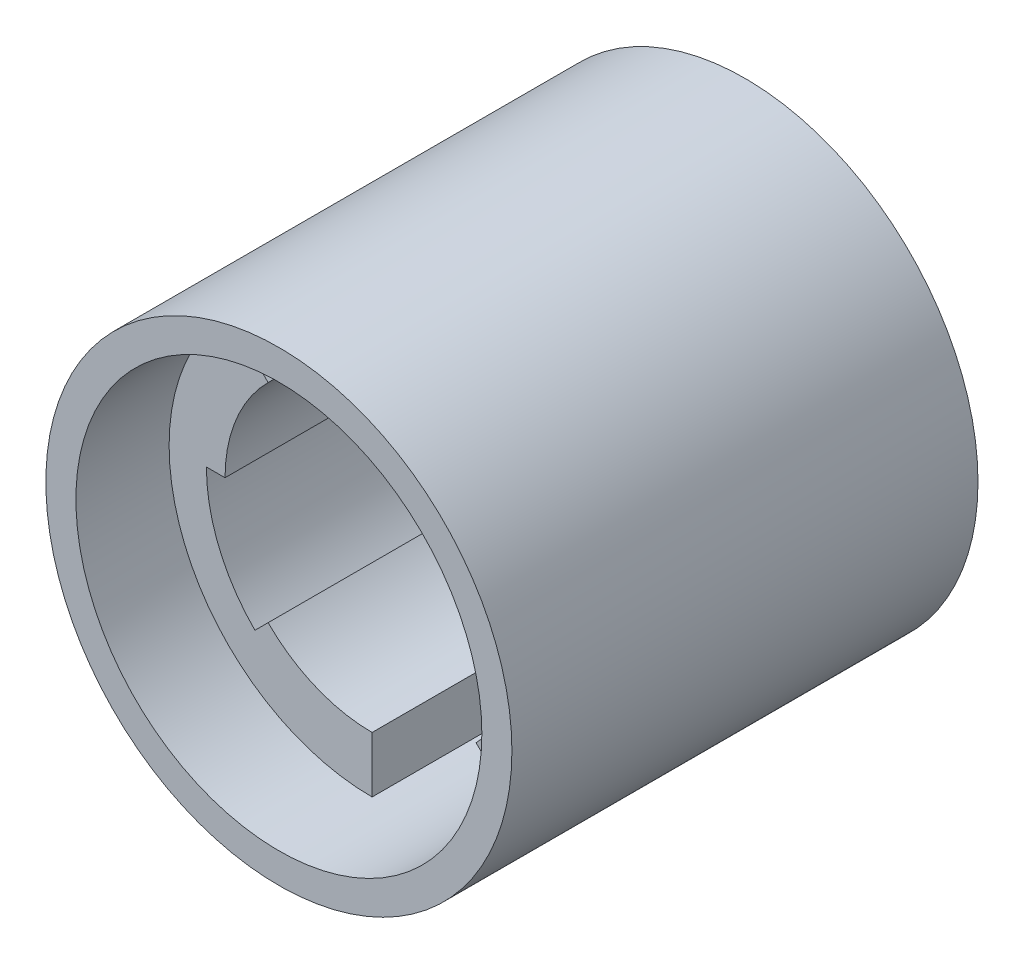
ISO-10303-21;
HEADER;
FILE_DESCRIPTION(('STEP AP214'),'2;1');
FILE_NAME('part.step','',(''),(''),'','','');
FILE_SCHEMA(('AUTOMOTIVE_DESIGN { 1 0 10303 214 1 1 1 1 }'));
ENDSEC;
DATA;
#1=APPLICATION_CONTEXT('core data for automotive mechanical design processes');
#2=APPLICATION_PROTOCOL_DEFINITION('international standard','automotive_design',2000,#1);
#3=PRODUCT_CONTEXT('',#1,'mechanical');
#4=PRODUCT('Part','Part','',(#3));
#5=PRODUCT_RELATED_PRODUCT_CATEGORY('part','',(#4));
#6=PRODUCT_DEFINITION_FORMATION('','',#4);
#7=PRODUCT_DEFINITION_CONTEXT('part definition',#1,'design');
#8=PRODUCT_DEFINITION('design','',#6,#7);
#9=PRODUCT_DEFINITION_SHAPE('','',#8);
#10=(LENGTH_UNIT() NAMED_UNIT(*) SI_UNIT(.MILLI.,.METRE.));
#11=(NAMED_UNIT(*) PLANE_ANGLE_UNIT() SI_UNIT($,.RADIAN.));
#12=(NAMED_UNIT(*) SI_UNIT($,.STERADIAN.) SOLID_ANGLE_UNIT());
#13=UNCERTAINTY_MEASURE_WITH_UNIT(LENGTH_MEASURE(1.E-05),#10,'distance_accuracy_value','');
#14=(GEOMETRIC_REPRESENTATION_CONTEXT(3) GLOBAL_UNCERTAINTY_ASSIGNED_CONTEXT((#13)) GLOBAL_UNIT_ASSIGNED_CONTEXT((#10,
#11,#12)) REPRESENTATION_CONTEXT('',''));
#15=CARTESIAN_POINT('',(0.,0.,0.));
#16=DIRECTION('',(0.,0.,1.));
#17=DIRECTION('',(1.,0.,0.));
#18=AXIS2_PLACEMENT_3D('',#15,#16,#17);
#19=CARTESIAN_POINT('',(0.,0.,40.));
#20=DIRECTION('',(0.,0.,-1.));
#21=DIRECTION('',(-1.,0.,0.));
#22=AXIS2_PLACEMENT_3D('',#19,#20,#21);
#23=PLANE('',#22);
#24=DIRECTION('',(0.,-1.,0.));
#25=VECTOR('',#24,1.);
#26=CARTESIAN_POINT('',(0.,0.,40.));
#27=LINE('',#26,#25);
#28=CARTESIAN_POINT('',(0.,21.775,40.));
#29=VERTEX_POINT('',#28);
#30=CARTESIAN_POINT('',(-2.8421709430404E-11,19.0256907860089,40.));
#31=VERTEX_POINT('',#30);
#32=EDGE_CURVE('E368',#29,#31,#27,.T.);
#33=ORIENTED_EDGE('',*,*,#32,.T.);
#34=DIRECTION('',(-0.382683432365091,-0.923879532511286,0.));
#35=VECTOR('',#34,1.);
#36=CARTESIAN_POINT('',(207098.900487391,500000.,40.));
#37=LINE('',#36,#35);
#38=CARTESIAN_POINT('',(1.12671862772536,21.745830178081,40.));
#39=VERTEX_POINT('',#38);
#40=EDGE_CURVE('E313',#39,#31,#37,.T.);
#41=ORIENTED_EDGE('',*,*,#40,.F.);
#42=CARTESIAN_POINT('',(0.,0.,40.));
#43=DIRECTION('',(0.,0.,-1.));
#44=DIRECTION('',(-1.,0.,0.));
#45=AXIS2_PLACEMENT_3D('',#42,#43,#44);
#46=CIRCLE('',#45,21.775);
#47=EDGE_CURVE('E371',#39,#29,#46,.F.);
#48=ORIENTED_EDGE('',*,*,#47,.T.);
#49=EDGE_LOOP('',(#33,#41,#48));
#50=FACE_BOUND('',#49,.T.);
#51=ADVANCED_FACE('F85',(#50),#23,.F.);
#52=CARTESIAN_POINT('',(15.397250160337,-15.3972501603371,40.));
#53=VERTEX_POINT('',#52);
#54=CARTESIAN_POINT('',(14.3012088322824,16.4202938748199,40.));
#55=VERTEX_POINT('',#54);
#56=EDGE_CURVE('E372',#53,#55,#46,.F.);
#57=ORIENTED_EDGE('',*,*,#56,.T.);
#58=DIRECTION('',(0.382683432365091,0.923879532511286,0.));
#59=VECTOR('',#58,1.);
#60=CARTESIAN_POINT('',(207112.028479592,499994.562207584,40.));
#61=LINE('',#60,#59);
#62=CARTESIAN_POINT('',(12.6655155217409,12.4713809006276,40.));
#63=VERTEX_POINT('',#62);
#64=EDGE_CURVE('E316',#63,#55,#61,.T.);
#65=ORIENTED_EDGE('',*,*,#64,.F.);
#66=CARTESIAN_POINT('',(0.,0.,40.));
#67=DIRECTION('',(0.,0.,-1.));
#68=DIRECTION('',(-1.,0.,0.));
#69=AXIS2_PLACEMENT_3D('',#66,#67,#68);
#70=CIRCLE('',#69,17.775);
#71=CARTESIAN_POINT('',(17.775,0.,40.));
#72=VERTEX_POINT('',#71);
#73=EDGE_CURVE('E382',#63,#72,#70,.T.);
#74=ORIENTED_EDGE('',*,*,#73,.T.);
#75=DIRECTION('',(-1.,0.,0.));
#76=VECTOR('',#75,1.);
#77=CARTESIAN_POINT('',(0.,0.,40.));
#78=LINE('',#77,#76);
#79=CARTESIAN_POINT('',(15.775,0.,40.));
#80=VERTEX_POINT('',#79);
#81=EDGE_CURVE('E380',#72,#80,#78,.T.);
#82=ORIENTED_EDGE('',*,*,#81,.T.);
#83=CARTESIAN_POINT('',(0.,0.,40.));
#84=DIRECTION('',(0.,0.,-1.));
#85=DIRECTION('',(-1.,0.,0.));
#86=AXIS2_PLACEMENT_3D('',#83,#84,#85);
#87=CIRCLE('',#86,15.775);
#88=CARTESIAN_POINT('',(11.1546094732177,-11.1546094732178,40.));
#89=VERTEX_POINT('',#88);
#90=EDGE_CURVE('E378',#80,#89,#87,.T.);
#91=ORIENTED_EDGE('',*,*,#90,.T.);
#92=DIRECTION('',(0.707106781186545,-0.70710678118655,0.));
#93=VECTOR('',#92,1.);
#94=CARTESIAN_POINT('',(0.,0.,40.));
#95=LINE('',#94,#93);
#96=EDGE_CURVE('E375',#89,#53,#95,.T.);
#97=ORIENTED_EDGE('',*,*,#96,.T.);
#98=EDGE_LOOP('',(#57,#65,#74,#82,#91,#97));
#99=FACE_BOUND('',#98,.T.);
#100=ADVANCED_FACE('F559',(#99),#23,.F.);
#101=DIRECTION('',(-0.707106781186551,-0.707106781186544,0.));
#102=VECTOR('',#101,1.);
#103=CARTESIAN_POINT('',(0.,0.,40.));
#104=LINE('',#103,#102);
#105=CARTESIAN_POINT('',(12.0736622911186,12.0736622911186,40.));
#106=VERTEX_POINT('',#105);
#107=CARTESIAN_POINT('',(11.1546094732178,11.1546094732177,40.));
#108=VERTEX_POINT('',#107);
#109=EDGE_CURVE('E384',#106,#108,#104,.T.);
#110=ORIENTED_EDGE('',*,*,#109,.F.);
#111=DIRECTION('',(-0.923879532511286,0.382683432365091,0.));
#112=VECTOR('',#111,1.);
#113=CARTESIAN_POINT('',(6.03683114555932,14.5741996253655,40.));
#114=LINE('',#113,#112);
#115=CARTESIAN_POINT('',(6.03683114555932,14.5741996253655,40.));
#116=VERTEX_POINT('',#115);
#117=EDGE_CURVE('E12',#106,#116,#114,.T.);
#118=ORIENTED_EDGE('',*,*,#117,.T.);
#119=CARTESIAN_POINT('',(0.,0.,40.));
#120=DIRECTION('',(0.,0.,-1.));
#121=DIRECTION('',(-1.,0.,0.));
#122=AXIS2_PLACEMENT_3D('',#119,#120,#121);
#123=CIRCLE('',#122,15.775);
#124=EDGE_CURVE('E367',#116,#108,#123,.T.);
#125=ORIENTED_EDGE('',*,*,#124,.T.);
#126=EDGE_LOOP('',(#110,#118,#125));
#127=FACE_BOUND('',#126,.T.);
#128=ADVANCED_FACE('F506',(#127),#23,.F.);
#129=CARTESIAN_POINT('',(0.,0.,50.));
#130=DIRECTION('',(0.,0.,-1.));
#131=DIRECTION('',(-1.,0.,0.));
#132=AXIS2_PLACEMENT_3D('',#129,#130,#131);
#133=CYLINDRICAL_SURFACE('',#132,21.775);
#134=DIRECTION('',(0.,0.,-1.));
#135=VECTOR('',#134,1.);
#136=CARTESIAN_POINT('',(21.6270386035079,2.53413224642682,50.));
#137=LINE('',#136,#135);
#138=CARTESIAN_POINT('',(21.6270386034994,2.53413224649958,45.6342392751291));
#139=VERTEX_POINT('',#138);
#140=CARTESIAN_POINT('',(21.6270386035043,2.53413224645769,40.0349843758119));
#141=VERTEX_POINT('',#140);
#142=EDGE_CURVE('E100',#139,#141,#137,.T.);
#143=ORIENTED_EDGE('',*,*,#142,.T.);
#144=CARTESIAN_POINT('',(0.,0.,40.0349843758119));
#145=DIRECTION('',(0.,0.,-1.));
#146=DIRECTION('',(-1.,0.,0.));
#147=AXIS2_PLACEMENT_3D('',#144,#145,#146);
#148=CIRCLE('',#147,21.775);
#149=CARTESIAN_POINT('',(16.3111049859026,14.4256188478664,40.0349843758119));
#150=VERTEX_POINT('',#149);
#151=EDGE_CURVE('E274',#141,#150,#148,.F.);
#152=ORIENTED_EDGE('',*,*,#151,.T.);
#153=DIRECTION('',(0.,0.,-1.));
#154=VECTOR('',#153,1.);
#155=CARTESIAN_POINT('',(16.3111049857729,14.4256188478379,50.));
#156=LINE('',#155,#154);
#157=CARTESIAN_POINT('',(16.3111049857729,14.4256188478379,44.3151820128625));
#158=VERTEX_POINT('',#157);
#159=EDGE_CURVE('E278',#150,#158,#156,.F.);
#160=ORIENTED_EDGE('',*,*,#159,.T.);
#161=CARTESIAN_POINT('',(0.,0.,44.3151820128625));
#162=DIRECTION('',(0.,0.,1.));
#163=DIRECTION('',(1.,0.,0.));
#164=AXIS2_PLACEMENT_3D('',#161,#162,#163);
#165=CIRCLE('',#164,21.775);
#166=CARTESIAN_POINT('',(16.648544757694,14.0348346071858,44.3151820128625));
#167=VERTEX_POINT('',#166);
#168=EDGE_CURVE('E292',#158,#167,#165,.F.);
#169=ORIENTED_EDGE('',*,*,#168,.T.);
#170=CARTESIAN_POINT('',(0.,0.,45.0094648019854));
#171=DIRECTION('',(-0.0400630088914515,0.0967206594152168,0.994504936820753));
#172=DIRECTION('',(-0.380580562726591,0.918802756110125,-0.104689687358168));
#173=AXIS2_PLACEMENT_3D('',#170,#171,#172);
#174=ELLIPSE('',#173,21.8953161455494,21.775);
#175=EDGE_CURVE('E105',#167,#139,#174,.F.);
#176=ORIENTED_EDGE('',*,*,#175,.T.);
#177=EDGE_LOOP('',(#143,#152,#160,#169,#176));
#178=FACE_BOUND('',#177,.T.);
#179=DIRECTION('',(0.,0.,-1.));
#180=VECTOR('',#179,1.);
#181=CARTESIAN_POINT('',(1.12671862772536,21.745830178081,50.));
#182=LINE('',#181,#180);
#183=CARTESIAN_POINT('',(1.12671862768821,21.7458301780198,42.1363490156694));
#184=VERTEX_POINT('',#183);
#185=EDGE_CURVE('E321',#39,#184,#182,.F.);
#186=ORIENTED_EDGE('',*,*,#185,.T.);
#187=CARTESIAN_POINT('',(0.,0.,43.2498084303704));
#188=DIRECTION('',(-0.139665626605928,0.0578513967375121,0.988507323513737));
#189=DIRECTION('',(-0.913261683931854,0.378285375480267,-0.151172984887206));
#190=AXIS2_PLACEMENT_3D('',#187,#188,#189);
#191=ELLIPSE('',#190,22.0281625457248,21.775);
#192=CARTESIAN_POINT('',(14.3012088322223,16.4202938747167,44.3094367531636));
#193=VERTEX_POINT('',#192);
#194=EDGE_CURVE('E357',#184,#193,#191,.F.);
#195=ORIENTED_EDGE('',*,*,#194,.T.);
#196=DIRECTION('',(0.,0.,-1.));
#197=VECTOR('',#196,1.);
#198=CARTESIAN_POINT('',(14.3012088322824,16.4202938748199,50.));
#199=LINE('',#198,#197);
#200=EDGE_CURVE('E354',#193,#55,#199,.T.);
#201=ORIENTED_EDGE('',*,*,#200,.T.);
#202=ORIENTED_EDGE('',*,*,#56,.F.);
#203=DIRECTION('',(0.,0.,-1.));
#204=VECTOR('',#203,1.);
#205=CARTESIAN_POINT('',(15.397250160337,-15.3972501603371,40.));
#206=LINE('',#205,#204);
#207=CARTESIAN_POINT('',(15.397250160337,-15.3972501603371,20.));
#208=VERTEX_POINT('',#207);
#209=EDGE_CURVE('E419',#53,#208,#206,.T.);
#210=ORIENTED_EDGE('',*,*,#209,.T.);
#211=CARTESIAN_POINT('',(0.,0.,20.));
#212=DIRECTION('',(0.,0.,-1.));
#213=DIRECTION('',(-1.,0.,0.));
#214=AXIS2_PLACEMENT_3D('',#211,#212,#213);
#215=CIRCLE('',#214,21.775);
#216=CARTESIAN_POINT('',(0.,21.775,20.));
#217=VERTEX_POINT('',#216);
#218=EDGE_CURVE('E391',#208,#217,#215,.F.);
#219=ORIENTED_EDGE('',*,*,#218,.T.);
#220=DIRECTION('',(0.,0.,-1.));
#221=VECTOR('',#220,1.);
#222=CARTESIAN_POINT('',(0.,21.775,40.));
#223=LINE('',#222,#221);
#224=EDGE_CURVE('E421',#29,#217,#223,.T.);
#225=ORIENTED_EDGE('',*,*,#224,.F.);
#226=ORIENTED_EDGE('',*,*,#47,.F.);
#227=EDGE_LOOP('',(#186,#195,#201,#202,#210,#219,#225,#226));
#228=FACE_BOUND('',#227,.T.);
#229=CARTESIAN_POINT('',(0.,0.,50.));
#230=DIRECTION('',(0.,0.,1.));
#231=DIRECTION('',(1.,0.,0.));
#232=AXIS2_PLACEMENT_3D('',#229,#230,#231);
#233=CIRCLE('',#232,21.775);
#234=CARTESIAN_POINT('',(21.775,0.,50.));
#235=VERTEX_POINT('',#234);
#236=EDGE_CURVE('E487',#235,#235,#233,.T.);
#237=ORIENTED_EDGE('',*,*,#236,.T.);
#238=EDGE_LOOP('',(#237));
#239=FACE_BOUND('',#238,.T.);
#240=CARTESIAN_POINT('',(0.,0.,0.));
#241=DIRECTION('',(0.,0.,1.));
#242=DIRECTION('',(1.,0.,0.));
#243=AXIS2_PLACEMENT_3D('',#240,#241,#242);
#244=CIRCLE('',#243,21.775);
#245=CARTESIAN_POINT('',(21.775,0.,0.));
#246=VERTEX_POINT('',#245);
#247=EDGE_CURVE('E471',#246,#246,#244,.T.);
#248=ORIENTED_EDGE('',*,*,#247,.F.);
#249=EDGE_LOOP('',(#248));
#250=FACE_BOUND('',#249,.T.);
#251=DIRECTION('',(0.,0.,-1.));
#252=VECTOR('',#251,1.);
#253=CARTESIAN_POINT('',(0.,-21.775,40.));
#254=LINE('',#253,#252);
#255=CARTESIAN_POINT('',(0.,-21.775,40.));
#256=VERTEX_POINT('',#255);
#257=CARTESIAN_POINT('',(0.,-21.775,20.));
#258=VERTEX_POINT('',#257);
#259=EDGE_CURVE('E482',#256,#258,#254,.T.);
#260=ORIENTED_EDGE('',*,*,#259,.F.);
#261=CARTESIAN_POINT('',(0.,0.,40.));
#262=DIRECTION('',(0.,0.,-1.));
#263=DIRECTION('',(-1.,0.,0.));
#264=AXIS2_PLACEMENT_3D('',#261,#262,#263);
#265=CIRCLE('',#264,21.775);
#266=CARTESIAN_POINT('',(-15.397250160337,15.3972501603371,40.));
#267=VERTEX_POINT('',#266);
#268=EDGE_CURVE('E431',#267,#256,#265,.F.);
#269=ORIENTED_EDGE('',*,*,#268,.F.);
#270=DIRECTION('',(0.,0.,-1.));
#271=VECTOR('',#270,1.);
#272=CARTESIAN_POINT('',(-15.397250160337,15.3972501603371,40.));
#273=LINE('',#272,#271);
#274=CARTESIAN_POINT('',(-15.397250160337,15.3972501603371,20.));
#275=VERTEX_POINT('',#274);
#276=EDGE_CURVE('E480',#267,#275,#273,.T.);
#277=ORIENTED_EDGE('',*,*,#276,.T.);
#278=CARTESIAN_POINT('',(0.,0.,20.));
#279=DIRECTION('',(0.,0.,-1.));
#280=DIRECTION('',(-1.,0.,0.));
#281=AXIS2_PLACEMENT_3D('',#278,#279,#280);
#282=CIRCLE('',#281,21.775);
#283=EDGE_CURVE('E453',#275,#258,#282,.F.);
#284=ORIENTED_EDGE('',*,*,#283,.T.);
#285=EDGE_LOOP('',(#260,#269,#277,#284));
#286=FACE_BOUND('',#285,.T.);
#287=ADVANCED_FACE('F276',(#178,#228,#239,#250,#286),#133,.F.);
#288=CARTESIAN_POINT('',(0.,0.,50.));
#289=DIRECTION('',(0.,0.,1.));
#290=DIRECTION('',(1.,0.,0.));
#291=AXIS2_PLACEMENT_3D('',#288,#289,#290);
#292=PLANE('',#291);
#293=CARTESIAN_POINT('',(0.,0.,50.));
#294=DIRECTION('',(0.,0.,1.));
#295=DIRECTION('',(1.,0.,0.));
#296=AXIS2_PLACEMENT_3D('',#293,#294,#295);
#297=CIRCLE('',#296,25.);
#298=CARTESIAN_POINT('',(25.,0.,50.));
#299=VERTEX_POINT('',#298);
#300=EDGE_CURVE('E93',#299,#299,#297,.T.);
#301=ORIENTED_EDGE('',*,*,#300,.T.);
#302=EDGE_LOOP('',(#301));
#303=FACE_BOUND('',#302,.T.);
#304=ORIENTED_EDGE('',*,*,#236,.F.);
#305=EDGE_LOOP('',(#304));
#306=FACE_BOUND('',#305,.T.);
#307=ADVANCED_FACE('F501',(#303,#306),#292,.T.);
#308=CARTESIAN_POINT('',(0.,0.,0.));
#309=DIRECTION('',(0.,0.,1.));
#310=DIRECTION('',(1.,0.,0.));
#311=AXIS2_PLACEMENT_3D('',#308,#309,#310);
#312=PLANE('',#311);
#313=CARTESIAN_POINT('',(0.,0.,0.));
#314=DIRECTION('',(0.,0.,1.));
#315=DIRECTION('',(1.,0.,0.));
#316=AXIS2_PLACEMENT_3D('',#313,#314,#315);
#317=CIRCLE('',#316,25.);
#318=CARTESIAN_POINT('',(25.,0.,0.));
#319=VERTEX_POINT('',#318);
#320=EDGE_CURVE('E490',#319,#319,#317,.T.);
#321=ORIENTED_EDGE('',*,*,#320,.F.);
#322=EDGE_LOOP('',(#321));
#323=FACE_BOUND('',#322,.T.);
#324=ORIENTED_EDGE('',*,*,#247,.T.);
#325=EDGE_LOOP('',(#324));
#326=FACE_BOUND('',#325,.T.);
#327=ADVANCED_FACE('F498',(#323,#326),#312,.F.);
#328=CARTESIAN_POINT('',(0.,0.,50.));
#329=DIRECTION('',(0.,0.,-1.));
#330=DIRECTION('',(-1.,0.,0.));
#331=AXIS2_PLACEMENT_3D('',#328,#329,#330);
#332=CYLINDRICAL_SURFACE('',#331,25.);
#333=ORIENTED_EDGE('',*,*,#300,.F.);
#334=EDGE_LOOP('',(#333));
#335=FACE_BOUND('',#334,.T.);
#336=ORIENTED_EDGE('',*,*,#320,.T.);
#337=EDGE_LOOP('',(#336));
#338=FACE_BOUND('',#337,.T.);
#339=ADVANCED_FACE('F87',(#335,#338),#332,.T.);
#340=CARTESIAN_POINT('',(0.,0.,40.));
#341=DIRECTION('',(0.,0.,-1.));
#342=DIRECTION('',(-1.,0.,0.));
#343=AXIS2_PLACEMENT_3D('',#340,#341,#342);
#344=CYLINDRICAL_SURFACE('',#343,15.7760793300043);
#345=CARTESIAN_POINT('',(0.,0.,20.));
#346=DIRECTION('',(0.,0.,-1.));
#347=DIRECTION('',(-1.,0.,0.));
#348=AXIS2_PLACEMENT_3D('',#345,#346,#347);
#349=CIRCLE('',#348,15.7760793300043);
#350=CARTESIAN_POINT('',(0.,-15.7760793300043,20.));
#351=VERTEX_POINT('',#350);
#352=CARTESIAN_POINT('',(-11.155372674783,-11.1553726747829,20.));
#353=VERTEX_POINT('',#352);
#354=EDGE_CURVE('E407',#351,#353,#349,.T.);
#355=ORIENTED_EDGE('',*,*,#354,.T.);
#356=DIRECTION('',(0.,0.,-1.));
#357=VECTOR('',#356,1.);
#358=CARTESIAN_POINT('',(-11.155372674783,-11.1553726747829,40.));
#359=LINE('',#358,#357);
#360=CARTESIAN_POINT('',(-11.155372674783,-11.1553726747829,40.));
#361=VERTEX_POINT('',#360);
#362=EDGE_CURVE('E469',#361,#353,#359,.T.);
#363=ORIENTED_EDGE('',*,*,#362,.F.);
#364=CARTESIAN_POINT('',(0.,0.,40.));
#365=DIRECTION('',(0.,0.,-1.));
#366=DIRECTION('',(-1.,0.,0.));
#367=AXIS2_PLACEMENT_3D('',#364,#365,#366);
#368=CIRCLE('',#367,15.7760793300043);
#369=CARTESIAN_POINT('',(0.,-15.7760793300043,40.));
#370=VERTEX_POINT('',#369);
#371=EDGE_CURVE('E426',#370,#361,#368,.T.);
#372=ORIENTED_EDGE('',*,*,#371,.F.);
#373=DIRECTION('',(0.,0.,-1.));
#374=VECTOR('',#373,1.);
#375=CARTESIAN_POINT('',(0.,-15.7760793300043,40.));
#376=LINE('',#375,#374);
#377=EDGE_CURVE('E448',#370,#351,#376,.T.);
#378=ORIENTED_EDGE('',*,*,#377,.T.);
#379=EDGE_LOOP('',(#355,#363,#372,#378));
#380=FACE_BOUND('',#379,.T.);
#381=ADVANCED_FACE('F523',(#380),#344,.F.);
#382=CARTESIAN_POINT('',(0.,0.,40.));
#383=DIRECTION('',(-0.707106781186545,0.70710678118655,0.));
#384=DIRECTION('',(-0.70710678118655,-0.707106781186545,0.));
#385=AXIS2_PLACEMENT_3D('',#382,#383,#384);
#386=PLANE('',#385);
#387=DIRECTION('',(0.70710678118655,0.707106781186545,0.));
#388=VECTOR('',#387,1.);
#389=CARTESIAN_POINT('',(0.,0.,20.));
#390=LINE('',#389,#388);
#391=CARTESIAN_POINT('',(-12.5695862371561,-12.569586237156,20.));
#392=VERTEX_POINT('',#391);
#393=EDGE_CURVE('E429',#392,#353,#390,.T.);
#394=ORIENTED_EDGE('',*,*,#393,.F.);
#395=DIRECTION('',(0.,0.,-1.));
#396=VECTOR('',#395,1.);
#397=CARTESIAN_POINT('',(-12.5695862371561,-12.569586237156,40.));
#398=LINE('',#397,#396);
#399=CARTESIAN_POINT('',(-12.5695862371561,-12.569586237156,40.));
#400=VERTEX_POINT('',#399);
#401=EDGE_CURVE('E472',#400,#392,#398,.T.);
#402=ORIENTED_EDGE('',*,*,#401,.F.);
#403=DIRECTION('',(0.70710678118655,0.707106781186545,0.));
#404=VECTOR('',#403,1.);
#405=CARTESIAN_POINT('',(0.,0.,40.));
#406=LINE('',#405,#404);
#407=EDGE_CURVE('E445',#400,#361,#406,.T.);
#408=ORIENTED_EDGE('',*,*,#407,.T.);
#409=ORIENTED_EDGE('',*,*,#362,.T.);
#410=EDGE_LOOP('',(#394,#402,#408,#409));
#411=FACE_BOUND('',#410,.T.);
#412=ADVANCED_FACE('F528',(#411),#386,.T.);
#413=CARTESIAN_POINT('',(0.,0.,40.));
#414=DIRECTION('',(0.,0.,-1.));
#415=DIRECTION('',(-1.,0.,0.));
#416=AXIS2_PLACEMENT_3D('',#413,#414,#415);
#417=CYLINDRICAL_SURFACE('',#416,17.7760793300043);
#418=CARTESIAN_POINT('',(0.,0.,20.));
#419=DIRECTION('',(0.,0.,-1.));
#420=DIRECTION('',(-1.,0.,0.));
#421=AXIS2_PLACEMENT_3D('',#418,#419,#420);
#422=CIRCLE('',#421,17.7760793300043);
#423=CARTESIAN_POINT('',(-17.7760793300043,0.,20.));
#424=VERTEX_POINT('',#423);
#425=EDGE_CURVE('E464',#424,#392,#422,.F.);
#426=ORIENTED_EDGE('',*,*,#425,.F.);
#427=DIRECTION('',(0.,0.,-1.));
#428=VECTOR('',#427,1.);
#429=CARTESIAN_POINT('',(-17.7760793300043,0.,40.));
#430=LINE('',#429,#428);
#431=CARTESIAN_POINT('',(-17.7760793300043,0.,40.));
#432=VERTEX_POINT('',#431);
#433=EDGE_CURVE('E474',#432,#424,#430,.T.);
#434=ORIENTED_EDGE('',*,*,#433,.F.);
#435=CARTESIAN_POINT('',(0.,0.,40.));
#436=DIRECTION('',(0.,0.,-1.));
#437=DIRECTION('',(-1.,0.,0.));
#438=AXIS2_PLACEMENT_3D('',#435,#436,#437);
#439=CIRCLE('',#438,17.7760793300043);
#440=EDGE_CURVE('E442',#432,#400,#439,.F.);
#441=ORIENTED_EDGE('',*,*,#440,.T.);
#442=ORIENTED_EDGE('',*,*,#401,.T.);
#443=EDGE_LOOP('',(#426,#434,#441,#442));
#444=FACE_BOUND('',#443,.T.);
#445=ADVANCED_FACE('F531',(#444),#417,.F.);
#446=CARTESIAN_POINT('',(0.,0.,40.));
#447=DIRECTION('',(0.,1.,0.));
#448=DIRECTION('',(-1.,0.,0.));
#449=AXIS2_PLACEMENT_3D('',#446,#447,#448);
#450=PLANE('',#449);
#451=DIRECTION('',(1.,0.,0.));
#452=VECTOR('',#451,1.);
#453=CARTESIAN_POINT('',(0.,0.,20.));
#454=LINE('',#453,#452);
#455=CARTESIAN_POINT('',(-15.7760793300043,0.,20.));
#456=VERTEX_POINT('',#455);
#457=EDGE_CURVE('E461',#424,#456,#454,.T.);
#458=ORIENTED_EDGE('',*,*,#457,.T.);
#459=DIRECTION('',(0.,0.,-1.));
#460=VECTOR('',#459,1.);
#461=CARTESIAN_POINT('',(-15.7760793300043,0.,40.));
#462=LINE('',#461,#460);
#463=CARTESIAN_POINT('',(-15.7760793300043,0.,40.));
#464=VERTEX_POINT('',#463);
#465=EDGE_CURVE('E476',#464,#456,#462,.T.);
#466=ORIENTED_EDGE('',*,*,#465,.F.);
#467=DIRECTION('',(1.,0.,0.));
#468=VECTOR('',#467,1.);
#469=CARTESIAN_POINT('',(0.,0.,40.));
#470=LINE('',#469,#468);
#471=EDGE_CURVE('E440',#432,#464,#470,.T.);
#472=ORIENTED_EDGE('',*,*,#471,.F.);
#473=ORIENTED_EDGE('',*,*,#433,.T.);
#474=EDGE_LOOP('',(#458,#466,#472,#473));
#475=FACE_BOUND('',#474,.T.);
#476=ADVANCED_FACE('F536',(#475),#450,.F.);
#477=CARTESIAN_POINT('',(0.,0.,40.));
#478=DIRECTION('',(0.,0.,-1.));
#479=DIRECTION('',(-1.,0.,0.));
#480=AXIS2_PLACEMENT_3D('',#477,#478,#479);
#481=CYLINDRICAL_SURFACE('',#480,15.7760793300043);
#482=CARTESIAN_POINT('',(0.,0.,20.));
#483=DIRECTION('',(0.,0.,-1.));
#484=DIRECTION('',(-1.,0.,0.));
#485=AXIS2_PLACEMENT_3D('',#482,#483,#484);
#486=CIRCLE('',#485,15.7760793300043);
#487=CARTESIAN_POINT('',(-11.155372674783,11.155372674783,20.));
#488=VERTEX_POINT('',#487);
#489=EDGE_CURVE('E458',#488,#456,#486,.F.);
#490=ORIENTED_EDGE('',*,*,#489,.F.);
#491=DIRECTION('',(0.,0.,-1.));
#492=VECTOR('',#491,1.);
#493=CARTESIAN_POINT('',(-11.155372674783,11.155372674783,40.));
#494=LINE('',#493,#492);
#495=CARTESIAN_POINT('',(-11.155372674783,11.155372674783,40.));
#496=VERTEX_POINT('',#495);
#497=EDGE_CURVE('E478',#496,#488,#494,.T.);
#498=ORIENTED_EDGE('',*,*,#497,.F.);
#499=CARTESIAN_POINT('',(0.,0.,40.));
#500=DIRECTION('',(0.,0.,-1.));
#501=DIRECTION('',(-1.,0.,0.));
#502=AXIS2_PLACEMENT_3D('',#499,#500,#501);
#503=CIRCLE('',#502,15.7760793300043);
#504=EDGE_CURVE('E437',#496,#464,#503,.F.);
#505=ORIENTED_EDGE('',*,*,#504,.T.);
#506=ORIENTED_EDGE('',*,*,#465,.T.);
#507=EDGE_LOOP('',(#490,#498,#505,#506));
#508=FACE_BOUND('',#507,.T.);
#509=ADVANCED_FACE('F539',(#508),#481,.F.);
#510=CARTESIAN_POINT('',(0.,0.,40.));
#511=DIRECTION('',(-0.707106781186549,-0.707106781186546,0.));
#512=DIRECTION('',(0.707106781186546,-0.707106781186549,0.));
#513=AXIS2_PLACEMENT_3D('',#510,#511,#512);
#514=PLANE('',#513);
#515=DIRECTION('',(-0.707106781186546,0.707106781186549,0.));
#516=VECTOR('',#515,1.);
#517=CARTESIAN_POINT('',(0.,0.,20.));
#518=LINE('',#517,#516);
#519=EDGE_CURVE('E455',#488,#275,#518,.T.);
#520=ORIENTED_EDGE('',*,*,#519,.T.);
#521=ORIENTED_EDGE('',*,*,#276,.F.);
#522=DIRECTION('',(-0.707106781186546,0.707106781186549,0.));
#523=VECTOR('',#522,1.);
#524=CARTESIAN_POINT('',(0.,0.,40.));
#525=LINE('',#524,#523);
#526=EDGE_CURVE('E434',#496,#267,#525,.T.);
#527=ORIENTED_EDGE('',*,*,#526,.F.);
#528=ORIENTED_EDGE('',*,*,#497,.T.);
#529=EDGE_LOOP('',(#520,#521,#527,#528));
#530=FACE_BOUND('',#529,.T.);
#531=ADVANCED_FACE('F542',(#530),#514,.F.);
#532=CARTESIAN_POINT('',(0.,0.,40.));
#533=DIRECTION('',(-1.,0.,0.));
#534=DIRECTION('',(0.,-1.,0.));
#535=AXIS2_PLACEMENT_3D('',#532,#533,#534);
#536=PLANE('',#535);
#537=DIRECTION('',(0.,1.,0.));
#538=VECTOR('',#537,1.);
#539=CARTESIAN_POINT('',(0.,0.,20.));
#540=LINE('',#539,#538);
#541=EDGE_CURVE('E451',#258,#351,#540,.T.);
#542=ORIENTED_EDGE('',*,*,#541,.T.);
#543=ORIENTED_EDGE('',*,*,#377,.F.);
#544=DIRECTION('',(0.,1.,0.));
#545=VECTOR('',#544,1.);
#546=CARTESIAN_POINT('',(0.,0.,40.));
#547=LINE('',#546,#545);
#548=EDGE_CURVE('E428',#256,#370,#547,.T.);
#549=ORIENTED_EDGE('',*,*,#548,.F.);
#550=ORIENTED_EDGE('',*,*,#259,.T.);
#551=EDGE_LOOP('',(#542,#543,#549,#550));
#552=FACE_BOUND('',#551,.T.);
#553=ADVANCED_FACE('F518',(#552),#536,.F.);
#554=CARTESIAN_POINT('',(0.,0.,40.));
#555=DIRECTION('',(0.,0.,-1.));
#556=DIRECTION('',(-1.,0.,0.));
#557=AXIS2_PLACEMENT_3D('',#554,#555,#556);
#558=PLANE('',#557);
#559=ORIENTED_EDGE('',*,*,#371,.T.);
#560=ORIENTED_EDGE('',*,*,#407,.F.);
#561=ORIENTED_EDGE('',*,*,#440,.F.);
#562=ORIENTED_EDGE('',*,*,#471,.T.);
#563=ORIENTED_EDGE('',*,*,#504,.F.);
#564=ORIENTED_EDGE('',*,*,#526,.T.);
#565=ORIENTED_EDGE('',*,*,#268,.T.);
#566=ORIENTED_EDGE('',*,*,#548,.T.);
#567=EDGE_LOOP('',(#559,#560,#561,#562,#563,#564,#565,#566));
#568=FACE_BOUND('',#567,.T.);
#569=ADVANCED_FACE('F513',(#568),#558,.F.);
#570=CARTESIAN_POINT('',(0.,0.,20.));
#571=DIRECTION('',(0.,0.,-1.));
#572=DIRECTION('',(-1.,0.,0.));
#573=AXIS2_PLACEMENT_3D('',#570,#571,#572);
#574=PLANE('',#573);
#575=ORIENTED_EDGE('',*,*,#354,.F.);
#576=ORIENTED_EDGE('',*,*,#541,.F.);
#577=ORIENTED_EDGE('',*,*,#283,.F.);
#578=ORIENTED_EDGE('',*,*,#519,.F.);
#579=ORIENTED_EDGE('',*,*,#489,.T.);
#580=ORIENTED_EDGE('',*,*,#457,.F.);
#581=ORIENTED_EDGE('',*,*,#425,.T.);
#582=ORIENTED_EDGE('',*,*,#393,.T.);
#583=EDGE_LOOP('',(#575,#576,#577,#578,#579,#580,#581,#582));
#584=FACE_BOUND('',#583,.T.);
#585=ADVANCED_FACE('F544',(#584),#574,.T.);
#586=CARTESIAN_POINT('',(0.,0.,40.));
#587=DIRECTION('',(0.,0.,-1.));
#588=DIRECTION('',(-1.,0.,0.));
#589=AXIS2_PLACEMENT_3D('',#586,#587,#588);
#590=CYLINDRICAL_SURFACE('',#589,15.775);
#591=CARTESIAN_POINT('',(0.,0.,20.));
#592=DIRECTION('',(0.,0.,-1.));
#593=DIRECTION('',(-1.,0.,0.));
#594=AXIS2_PLACEMENT_3D('',#591,#592,#593);
#595=CIRCLE('',#594,15.775);
#596=CARTESIAN_POINT('',(0.,15.775,20.));
#597=VERTEX_POINT('',#596);
#598=CARTESIAN_POINT('',(11.1546094732178,11.1546094732177,20.));
#599=VERTEX_POINT('',#598);
#600=EDGE_CURVE('E331',#597,#599,#595,.T.);
#601=ORIENTED_EDGE('',*,*,#600,.T.);
#602=DIRECTION('',(0.,0.,-1.));
#603=VECTOR('',#602,1.);
#604=CARTESIAN_POINT('',(11.1546094732178,11.1546094732177,40.));
#605=LINE('',#604,#603);
#606=EDGE_CURVE('E405',#108,#599,#605,.T.);
#607=ORIENTED_EDGE('',*,*,#606,.F.);
#608=ORIENTED_EDGE('',*,*,#124,.F.);
#609=CARTESIAN_POINT('',(0.,15.775,40.));
#610=VERTEX_POINT('',#609);
#611=EDGE_CURVE('E363',#610,#116,#123,.T.);
#612=ORIENTED_EDGE('',*,*,#611,.F.);
#613=DIRECTION('',(0.,0.,-1.));
#614=VECTOR('',#613,1.);
#615=CARTESIAN_POINT('',(0.,15.775,40.));
#616=LINE('',#615,#614);
#617=EDGE_CURVE('E386',#610,#597,#616,.T.);
#618=ORIENTED_EDGE('',*,*,#617,.T.);
#619=EDGE_LOOP('',(#601,#607,#608,#612,#618));
#620=FACE_BOUND('',#619,.T.);
#621=ADVANCED_FACE('F546',(#620),#590,.F.);
#622=CARTESIAN_POINT('',(0.,0.,40.));
#623=DIRECTION('',(0.707106781186544,-0.707106781186551,0.));
#624=DIRECTION('',(0.707106781186551,0.707106781186544,0.));
#625=AXIS2_PLACEMENT_3D('',#622,#623,#624);
#626=PLANE('',#625);
#627=DIRECTION('',(-0.707106781186551,-0.707106781186544,0.));
#628=VECTOR('',#627,1.);
#629=CARTESIAN_POINT('',(353549.450243697,353549.450243693,39.9632612781751));
#630=LINE('',#629,#628);
#631=CARTESIAN_POINT('',(12.5688230356218,12.5688230355649,39.9632612781751));
#632=VERTEX_POINT('',#631);
#633=CARTESIAN_POINT('',(12.0736622911186,12.0736622911186,39.9632612781751));
#634=VERTEX_POINT('',#633);
#635=EDGE_CURVE('E351',#632,#634,#630,.T.);
#636=ORIENTED_EDGE('',*,*,#635,.T.);
#637=DIRECTION('',(0.,0.,1.));
#638=VECTOR('',#637,1.);
#639=CARTESIAN_POINT('',(12.0736622911186,12.0736622911186,0.));
#640=LINE('',#639,#638);
#641=EDGE_CURVE('E360',#634,#106,#640,.T.);
#642=ORIENTED_EDGE('',*,*,#641,.T.);
#643=ORIENTED_EDGE('',*,*,#109,.T.);
#644=ORIENTED_EDGE('',*,*,#606,.T.);
#645=DIRECTION('',(-0.707106781186551,-0.707106781186544,0.));
#646=VECTOR('',#645,1.);
#647=CARTESIAN_POINT('',(0.,0.,20.));
#648=LINE('',#647,#646);
#649=CARTESIAN_POINT('',(12.5688230355909,12.5688230355908,20.));
#650=VERTEX_POINT('',#649);
#651=EDGE_CURVE('E402',#650,#599,#648,.T.);
#652=ORIENTED_EDGE('',*,*,#651,.F.);
#653=DIRECTION('',(0.,0.,-1.));
#654=VECTOR('',#653,1.);
#655=CARTESIAN_POINT('',(12.5688230355909,12.5688230355908,40.));
#656=LINE('',#655,#654);
#657=EDGE_CURVE('E408',#632,#650,#656,.T.);
#658=ORIENTED_EDGE('',*,*,#657,.F.);
#659=EDGE_LOOP('',(#636,#642,#643,#644,#652,#658));
#660=FACE_BOUND('',#659,.T.);
#661=ADVANCED_FACE('F553',(#660),#626,.T.);
#662=CARTESIAN_POINT('',(0.,0.,40.));
#663=DIRECTION('',(0.,0.,-1.));
#664=DIRECTION('',(-1.,0.,0.));
#665=AXIS2_PLACEMENT_3D('',#662,#663,#664);
#666=CYLINDRICAL_SURFACE('',#665,17.775);
#667=ORIENTED_EDGE('',*,*,#73,.F.);
#668=DIRECTION('',(0.,0.,-1.));
#669=VECTOR('',#668,1.);
#670=CARTESIAN_POINT('',(12.6655155217409,12.4713809006276,40.));
#671=LINE('',#670,#669);
#672=CARTESIAN_POINT('',(12.6655155217179,12.4713809005925,39.9632612781751));
#673=VERTEX_POINT('',#672);
#674=EDGE_CURVE('E319',#673,#63,#671,.F.);
#675=ORIENTED_EDGE('',*,*,#674,.F.);
#676=CARTESIAN_POINT('',(0.,0.,39.9632612781751));
#677=DIRECTION('',(0.,0.,-1.));
#678=DIRECTION('',(-1.,0.,0.));
#679=AXIS2_PLACEMENT_3D('',#676,#677,#678);
#680=CIRCLE('',#679,17.775);
#681=EDGE_CURVE('E310',#632,#673,#680,.T.);
#682=ORIENTED_EDGE('',*,*,#681,.F.);
#683=ORIENTED_EDGE('',*,*,#657,.T.);
#684=CARTESIAN_POINT('',(0.,0.,20.));
#685=DIRECTION('',(0.,0.,-1.));
#686=DIRECTION('',(-1.,0.,0.));
#687=AXIS2_PLACEMENT_3D('',#684,#685,#686);
#688=CIRCLE('',#687,17.775);
#689=CARTESIAN_POINT('',(17.775,0.,20.));
#690=VERTEX_POINT('',#689);
#691=EDGE_CURVE('E400',#650,#690,#688,.T.);
#692=ORIENTED_EDGE('',*,*,#691,.T.);
#693=DIRECTION('',(0.,0.,-1.));
#694=VECTOR('',#693,1.);
#695=CARTESIAN_POINT('',(17.775,0.,40.));
#696=LINE('',#695,#694);
#697=EDGE_CURVE('E410',#72,#690,#696,.T.);
#698=ORIENTED_EDGE('',*,*,#697,.F.);
#699=EDGE_LOOP('',(#667,#675,#682,#683,#692,#698));
#700=FACE_BOUND('',#699,.T.);
#701=ADVANCED_FACE('F610',(#700),#666,.F.);
#702=CARTESIAN_POINT('',(0.,0.,40.));
#703=DIRECTION('',(0.,-1.,0.));
#704=DIRECTION('',(0.,0.,-1.));
#705=AXIS2_PLACEMENT_3D('',#702,#703,#704);
#706=PLANE('',#705);
#707=DIRECTION('',(-1.,0.,0.));
#708=VECTOR('',#707,1.);
#709=CARTESIAN_POINT('',(0.,0.,20.));
#710=LINE('',#709,#708);
#711=CARTESIAN_POINT('',(15.775,0.,20.));
#712=VERTEX_POINT('',#711);
#713=EDGE_CURVE('E398',#690,#712,#710,.T.);
#714=ORIENTED_EDGE('',*,*,#713,.T.);
#715=DIRECTION('',(0.,0.,-1.));
#716=VECTOR('',#715,1.);
#717=CARTESIAN_POINT('',(15.775,0.,40.));
#718=LINE('',#717,#716);
#719=EDGE_CURVE('E413',#80,#712,#718,.T.);
#720=ORIENTED_EDGE('',*,*,#719,.F.);
#721=ORIENTED_EDGE('',*,*,#81,.F.);
#722=ORIENTED_EDGE('',*,*,#697,.T.);
#723=EDGE_LOOP('',(#714,#720,#721,#722));
#724=FACE_BOUND('',#723,.T.);
#725=ADVANCED_FACE('F640',(#724),#706,.F.);
#726=CARTESIAN_POINT('',(0.,0.,40.));
#727=DIRECTION('',(0.,0.,-1.));
#728=DIRECTION('',(-1.,0.,0.));
#729=AXIS2_PLACEMENT_3D('',#726,#727,#728);
#730=CYLINDRICAL_SURFACE('',#729,15.775);
#731=CARTESIAN_POINT('',(0.,0.,20.));
#732=DIRECTION('',(0.,0.,-1.));
#733=DIRECTION('',(-1.,0.,0.));
#734=AXIS2_PLACEMENT_3D('',#731,#732,#733);
#735=CIRCLE('',#734,15.775);
#736=CARTESIAN_POINT('',(11.1546094732177,-11.1546094732178,20.));
#737=VERTEX_POINT('',#736);
#738=EDGE_CURVE('E396',#712,#737,#735,.T.);
#739=ORIENTED_EDGE('',*,*,#738,.T.);
#740=DIRECTION('',(0.,0.,-1.));
#741=VECTOR('',#740,1.);
#742=CARTESIAN_POINT('',(11.1546094732177,-11.1546094732178,40.));
#743=LINE('',#742,#741);
#744=EDGE_CURVE('E416',#89,#737,#743,.T.);
#745=ORIENTED_EDGE('',*,*,#744,.F.);
#746=ORIENTED_EDGE('',*,*,#90,.F.);
#747=ORIENTED_EDGE('',*,*,#719,.T.);
#748=EDGE_LOOP('',(#739,#745,#746,#747));
#749=FACE_BOUND('',#748,.T.);
#750=ADVANCED_FACE('F646',(#749),#730,.F.);
#751=CARTESIAN_POINT('',(0.,0.,40.));
#752=DIRECTION('',(0.70710678118655,0.707106781186545,0.));
#753=DIRECTION('',(-0.707106781186545,0.70710678118655,0.));
#754=AXIS2_PLACEMENT_3D('',#751,#752,#753);
#755=PLANE('',#754);
#756=DIRECTION('',(0.707106781186545,-0.70710678118655,0.));
#757=VECTOR('',#756,1.);
#758=CARTESIAN_POINT('',(0.,0.,20.));
#759=LINE('',#758,#757);
#760=EDGE_CURVE('E393',#737,#208,#759,.T.);
#761=ORIENTED_EDGE('',*,*,#760,.T.);
#762=ORIENTED_EDGE('',*,*,#209,.F.);
#763=ORIENTED_EDGE('',*,*,#96,.F.);
#764=ORIENTED_EDGE('',*,*,#744,.T.);
#765=EDGE_LOOP('',(#761,#762,#763,#764));
#766=FACE_BOUND('',#765,.T.);
#767=ADVANCED_FACE('F582',(#766),#755,.F.);
#768=CARTESIAN_POINT('',(0.,0.,40.));
#769=DIRECTION('',(1.,0.,0.));
#770=DIRECTION('',(0.,1.,0.));
#771=AXIS2_PLACEMENT_3D('',#768,#769,#770);
#772=PLANE('',#771);
#773=DIRECTION('',(0.,-1.,0.));
#774=VECTOR('',#773,1.);
#775=CARTESIAN_POINT('',(2.8421709430404E-10,500000.,39.9632612781751));
#776=LINE('',#775,#774);
#777=CARTESIAN_POINT('',(1.45974412625063E-11,19.0256907861226,39.9632612781751));
#778=VERTEX_POINT('',#777);
#779=CARTESIAN_POINT('',(0.,17.0747369596125,39.9632612781751));
#780=VERTEX_POINT('',#779);
#781=EDGE_CURVE('E312',#778,#780,#776,.T.);
#782=ORIENTED_EDGE('',*,*,#781,.F.);
#783=DIRECTION('',(0.,0.,-1.));
#784=VECTOR('',#783,1.);
#785=CARTESIAN_POINT('',(2.8421709430404E-11,19.0256907861226,42.1363490156694));
#786=LINE('',#785,#784);
#787=EDGE_CURVE('E315',#31,#778,#786,.T.);
#788=ORIENTED_EDGE('',*,*,#787,.F.);
#789=ORIENTED_EDGE('',*,*,#32,.F.);
#790=ORIENTED_EDGE('',*,*,#224,.T.);
#791=DIRECTION('',(0.,-1.,0.));
#792=VECTOR('',#791,1.);
#793=CARTESIAN_POINT('',(0.,0.,20.));
#794=LINE('',#793,#792);
#795=EDGE_CURVE('E389',#217,#597,#794,.T.);
#796=ORIENTED_EDGE('',*,*,#795,.T.);
#797=ORIENTED_EDGE('',*,*,#617,.F.);
#798=CARTESIAN_POINT('',(0.,17.0747369596125,40.));
#799=VERTEX_POINT('',#798);
#800=EDGE_CURVE('E366',#799,#610,#27,.T.);
#801=ORIENTED_EDGE('',*,*,#800,.F.);
#802=DIRECTION('',(0.,0.,1.));
#803=VECTOR('',#802,1.);
#804=CARTESIAN_POINT('',(0.,17.0747369596125,0.));
#805=LINE('',#804,#803);
#806=EDGE_CURVE('E325',#780,#799,#805,.T.);
#807=ORIENTED_EDGE('',*,*,#806,.F.);
#808=EDGE_LOOP('',(#782,#788,#789,#790,#796,#797,#801,#807));
#809=FACE_BOUND('',#808,.T.);
#810=ADVANCED_FACE('F572',(#809),#772,.F.);
#811=ORIENTED_EDGE('',*,*,#611,.T.);
#812=DIRECTION('',(0.923879532511286,-0.382683432365091,0.));
#813=VECTOR('',#812,1.);
#814=CARTESIAN_POINT('',(6.03683114555932,14.5741996253655,40.));
#815=LINE('',#814,#813);
#816=EDGE_CURVE('E318',#799,#116,#815,.T.);
#817=ORIENTED_EDGE('',*,*,#816,.F.);
#818=ORIENTED_EDGE('',*,*,#800,.T.);
#819=EDGE_LOOP('',(#811,#817,#818));
#820=FACE_BOUND('',#819,.T.);
#821=ADVANCED_FACE('F562',(#820),#23,.F.);
#822=CARTESIAN_POINT('',(0.,0.,20.));
#823=DIRECTION('',(0.,0.,-1.));
#824=DIRECTION('',(-1.,0.,0.));
#825=AXIS2_PLACEMENT_3D('',#822,#823,#824);
#826=PLANE('',#825);
#827=ORIENTED_EDGE('',*,*,#600,.F.);
#828=ORIENTED_EDGE('',*,*,#795,.F.);
#829=ORIENTED_EDGE('',*,*,#218,.F.);
#830=ORIENTED_EDGE('',*,*,#760,.F.);
#831=ORIENTED_EDGE('',*,*,#738,.F.);
#832=ORIENTED_EDGE('',*,*,#713,.F.);
#833=ORIENTED_EDGE('',*,*,#691,.F.);
#834=ORIENTED_EDGE('',*,*,#651,.T.);
#835=EDGE_LOOP('',(#827,#828,#829,#830,#831,#832,#833,#834));
#836=FACE_BOUND('',#835,.T.);
#837=ADVANCED_FACE('F571',(#836),#826,.T.);
#838=CARTESIAN_POINT('',(207098.900487391,500000.,39.9632612781751));
#839=DIRECTION('',(0.,0.,-1.));
#840=DIRECTION('',(-1.,0.,0.));
#841=AXIS2_PLACEMENT_3D('',#838,#839,#840);
#842=PLANE('',#841);
#843=DIRECTION('',(-0.382683432365091,-0.923879532511286,0.));
#844=VECTOR('',#843,1.);
#845=CARTESIAN_POINT('',(207098.900487391,500000.,39.9632612781751));
#846=LINE('',#845,#844);
#847=CARTESIAN_POINT('',(-0.689766340240317,17.3604475326085,39.9632612781751));
#848=VERTEX_POINT('',#847);
#849=EDGE_CURVE('E327',#778,#848,#846,.T.);
#850=ORIENTED_EDGE('',*,*,#849,.F.);
#851=ORIENTED_EDGE('',*,*,#781,.T.);
#852=DIRECTION('',(0.923879532511286,-0.382683432365091,0.));
#853=VECTOR('',#852,1.);
#854=CARTESIAN_POINT('',(-0.689766340240317,17.3604475326085,39.9632612781751));
#855=LINE('',#854,#853);
#856=EDGE_CURVE('E340',#848,#780,#855,.T.);
#857=ORIENTED_EDGE('',*,*,#856,.F.);
#858=EDGE_LOOP('',(#850,#851,#857));
#859=FACE_BOUND('',#858,.T.);
#860=ADVANCED_FACE('F579',(#859),#842,.T.);
#861=CARTESIAN_POINT('',(207098.900487391,500000.,42.1363490156694));
#862=DIRECTION('',(-0.923879532511286,0.382683432365091,0.));
#863=DIRECTION('',(-0.382683432365091,-0.923879532511286,0.));
#864=AXIS2_PLACEMENT_3D('',#861,#862,#863);
#865=PLANE('',#864);
#866=ORIENTED_EDGE('',*,*,#40,.T.);
#867=ORIENTED_EDGE('',*,*,#787,.T.);
#868=ORIENTED_EDGE('',*,*,#849,.T.);
#869=DIRECTION('',(0.,0.,-1.));
#870=VECTOR('',#869,1.);
#871=CARTESIAN_POINT('',(-0.689766340240317,17.3604475326085,42.1363490156694));
#872=LINE('',#871,#870);
#873=CARTESIAN_POINT('',(-0.689766340240317,17.3604475326085,42.1363490156694));
#874=VERTEX_POINT('',#873);
#875=EDGE_CURVE('E328',#874,#848,#872,.T.);
#876=ORIENTED_EDGE('',*,*,#875,.F.);
#877=DIRECTION('',(-0.382683432365091,-0.923879532511286,0.));
#878=VECTOR('',#877,1.);
#879=CARTESIAN_POINT('',(207098.900487391,500000.,42.1363490156694));
#880=LINE('',#879,#878);
#881=EDGE_CURVE('E337',#184,#874,#880,.T.);
#882=ORIENTED_EDGE('',*,*,#881,.F.);
#883=ORIENTED_EDGE('',*,*,#185,.F.);
#884=EDGE_LOOP('',(#866,#867,#868,#876,#882,#883));
#885=FACE_BOUND('',#884,.T.);
#886=ADVANCED_FACE('F623',(#885),#865,.T.);
#887=CARTESIAN_POINT('',(207112.028479592,499994.562207584,44.3094367531636));
#888=DIRECTION('',(-0.139665626605928,0.0578513967375121,0.988507323513737));
#889=DIRECTION('',(0.990165647514665,0.,0.139899930242528));
#890=AXIS2_PLACEMENT_3D('',#887,#888,#889);
#891=PLANE('',#890);
#892=ORIENTED_EDGE('',*,*,#194,.F.);
#893=ORIENTED_EDGE('',*,*,#881,.T.);
#894=DIRECTION('',(-0.913261683931854,0.378285375480267,-0.151172984887206));
#895=VECTOR('',#894,1.);
#896=CARTESIAN_POINT('',(12.4382258599296,11.9226551165699,44.3094367531636));
#897=LINE('',#896,#895);
#898=CARTESIAN_POINT('',(12.4382258599296,11.9226551165699,44.3094367531636));
#899=VERTEX_POINT('',#898);
#900=EDGE_CURVE('E333',#899,#874,#897,.T.);
#901=ORIENTED_EDGE('',*,*,#900,.F.);
#902=DIRECTION('',(-0.382683432365091,-0.923879532511286,0.));
#903=VECTOR('',#902,1.);
#904=CARTESIAN_POINT('',(207112.028479592,499994.562207584,44.3094367531636));
#905=LINE('',#904,#903);
#906=EDGE_CURVE('E346',#193,#899,#905,.T.);
#907=ORIENTED_EDGE('',*,*,#906,.F.);
#908=EDGE_LOOP('',(#892,#893,#901,#907));
#909=FACE_BOUND('',#908,.T.);
#910=ADVANCED_FACE('F619',(#909),#891,.T.);
#911=CARTESIAN_POINT('',(207112.028479592,499994.562207584,39.9632612781751));
#912=DIRECTION('',(0.923879532511286,-0.382683432365091,0.));
#913=DIRECTION('',(0.382683432365091,0.923879532511286,0.));
#914=AXIS2_PLACEMENT_3D('',#911,#912,#913);
#915=PLANE('',#914);
#916=DIRECTION('',(-0.382683432365091,-0.923879532511286,0.));
#917=VECTOR('',#916,1.);
#918=CARTESIAN_POINT('',(207112.028479592,499994.562207584,39.9632612781751));
#919=LINE('',#918,#917);
#920=CARTESIAN_POINT('',(12.4382258599296,11.9226551165699,39.9632612781751));
#921=VERTEX_POINT('',#920);
#922=EDGE_CURVE('E344',#673,#921,#919,.T.);
#923=ORIENTED_EDGE('',*,*,#922,.F.);
#924=ORIENTED_EDGE('',*,*,#674,.T.);
#925=ORIENTED_EDGE('',*,*,#64,.T.);
#926=ORIENTED_EDGE('',*,*,#200,.F.);
#927=ORIENTED_EDGE('',*,*,#906,.T.);
#928=DIRECTION('',(0.,0.,1.));
#929=VECTOR('',#928,1.);
#930=CARTESIAN_POINT('',(12.4382258599296,11.9226551165699,39.9632612781751));
#931=LINE('',#930,#929);
#932=EDGE_CURVE('E336',#921,#899,#931,.T.);
#933=ORIENTED_EDGE('',*,*,#932,.F.);
#934=EDGE_LOOP('',(#923,#924,#925,#926,#927,#933));
#935=FACE_BOUND('',#934,.T.);
#936=ADVANCED_FACE('F606',(#935),#915,.T.);
#937=ORIENTED_EDGE('',*,*,#635,.F.);
#938=ORIENTED_EDGE('',*,*,#681,.T.);
#939=ORIENTED_EDGE('',*,*,#922,.T.);
#940=EDGE_CURVE('E332',#634,#921,#855,.T.);
#941=ORIENTED_EDGE('',*,*,#940,.F.);
#942=EDGE_LOOP('',(#937,#938,#939,#941));
#943=FACE_BOUND('',#942,.T.);
#944=ADVANCED_FACE('F601',(#943),#842,.T.);
#945=CARTESIAN_POINT('',(6.03683114555932,14.5741996253655,0.));
#946=DIRECTION('',(-0.382683432365091,-0.923879532511286,0.));
#947=DIRECTION('',(0.923879532511286,-0.382683432365091,0.));
#948=AXIS2_PLACEMENT_3D('',#945,#946,#947);
#949=PLANE('',#948);
#950=ORIENTED_EDGE('',*,*,#641,.F.);
#951=ORIENTED_EDGE('',*,*,#940,.T.);
#952=ORIENTED_EDGE('',*,*,#932,.T.);
#953=ORIENTED_EDGE('',*,*,#900,.T.);
#954=ORIENTED_EDGE('',*,*,#875,.T.);
#955=ORIENTED_EDGE('',*,*,#856,.T.);
#956=ORIENTED_EDGE('',*,*,#806,.T.);
#957=ORIENTED_EDGE('',*,*,#816,.T.);
#958=ORIENTED_EDGE('',*,*,#117,.F.);
#959=EDGE_LOOP('',(#950,#951,#952,#953,#954,#955,#956,#957,#958));
#960=FACE_BOUND('',#959,.T.);
#961=ADVANCED_FACE('F581',(#960),#949,.T.);
#962=CARTESIAN_POINT('',(500004.982775861,207102.421039429,40.0349843758119));
#963=DIRECTION('',(0.,0.,-1.));
#964=DIRECTION('',(-1.,0.,0.));
#965=AXIS2_PLACEMENT_3D('',#962,#963,#964);
#966=PLANE('',#965);
#967=ORIENTED_EDGE('',*,*,#151,.F.);
#968=DIRECTION('',(-0.923879532511288,-0.382683432365088,0.));
#969=VECTOR('',#968,1.);
#970=CARTESIAN_POINT('',(500004.982775861,207102.421039429,40.0349843758119));
#971=LINE('',#970,#969);
#972=CARTESIAN_POINT('',(18.6932141174463,1.31890235467208,40.0349843758119));
#973=VERTEX_POINT('',#972);
#974=EDGE_CURVE('E283',#141,#973,#971,.T.);
#975=ORIENTED_EDGE('',*,*,#974,.T.);
#976=DIRECTION('',(0.382683432365088,-0.923879532511288,0.));
#977=VECTOR('',#976,1.);
#978=CARTESIAN_POINT('',(18.6932141174463,1.31890235467208,40.0349843758119));
#979=LINE('',#978,#977);
#980=CARTESIAN_POINT('',(13.7104382561833,13.3483874171986,40.0349843758119));
#981=VERTEX_POINT('',#980);
#982=EDGE_CURVE('E297',#981,#973,#979,.T.);
#983=ORIENTED_EDGE('',*,*,#982,.F.);
#984=DIRECTION('',(-0.923879532511288,-0.382683432365088,0.));
#985=VECTOR('',#984,1.);
#986=CARTESIAN_POINT('',(500000.,207114.450524492,40.0349843758119));
#987=LINE('',#986,#985);
#988=EDGE_CURVE('E289',#150,#981,#987,.T.);
#989=ORIENTED_EDGE('',*,*,#988,.F.);
#990=EDGE_LOOP('',(#967,#975,#983,#989));
#991=FACE_BOUND('',#990,.T.);
#992=ADVANCED_FACE('F295',(#991),#966,.T.);
#993=CARTESIAN_POINT('',(500000.187580004,207113.997666303,44.3151820128625));
#994=DIRECTION('',(-0.0400630088914515,0.0967206594152168,0.994504936820753));
#995=DIRECTION('',(0.,-0.995304011291941,0.0967983734686254));
#996=AXIS2_PLACEMENT_3D('',#993,#994,#995);
#997=PLANE('',#996);
#998=ORIENTED_EDGE('',*,*,#175,.F.);
#999=DIRECTION('',(-0.923879532511288,-0.382683432365088,0.));
#1000=VECTOR('',#999,1.);
#1001=CARTESIAN_POINT('',(500000.187580004,207113.997666303,44.3151820128625));
#1002=LINE('',#1001,#1000);
#1003=CARTESIAN_POINT('',(13.8980182599168,12.8955292281553,44.3151820128625));
#1004=VERTEX_POINT('',#1003);
#1005=EDGE_CURVE('E303',#167,#1004,#1002,.T.);
#1006=ORIENTED_EDGE('',*,*,#1005,.T.);
#1007=DIRECTION('',(-0.38058056272659,0.918802756110125,-0.104689687358168));
#1008=VECTOR('',#1007,1.);
#1009=CARTESIAN_POINT('',(13.8980182599168,12.8955292281553,44.3151820128625));
#1010=LINE('',#1009,#1008);
#1011=CARTESIAN_POINT('',(18.6932141174463,1.31890235467208,45.6342392751394));
#1012=VERTEX_POINT('',#1011);
#1013=EDGE_CURVE('E301',#1012,#1004,#1010,.T.);
#1014=ORIENTED_EDGE('',*,*,#1013,.F.);
#1015=DIRECTION('',(-0.923879532511288,-0.382683432365088,0.));
#1016=VECTOR('',#1015,1.);
#1017=CARTESIAN_POINT('',(500004.982775861,207102.421039429,45.6342392751394));
#1018=LINE('',#1017,#1016);
#1019=EDGE_CURVE('E1016',#139,#1012,#1018,.T.);
#1020=ORIENTED_EDGE('',*,*,#1019,.F.);
#1021=EDGE_LOOP('',(#998,#1006,#1014,#1020));
#1022=FACE_BOUND('',#1021,.T.);
#1023=ADVANCED_FACE('F675',(#1022),#997,.T.);
#1024=CARTESIAN_POINT('',(500000.,207114.450524492,44.3151820128625));
#1025=DIRECTION('',(0.,0.,1.));
#1026=DIRECTION('',(1.,0.,0.));
#1027=AXIS2_PLACEMENT_3D('',#1024,#1025,#1026);
#1028=PLANE('',#1027);
#1029=ORIENTED_EDGE('',*,*,#168,.F.);
#1030=DIRECTION('',(-0.923879532511288,-0.382683432365088,0.));
#1031=VECTOR('',#1030,1.);
#1032=CARTESIAN_POINT('',(500000.,207114.450524492,44.3151820128625));
#1033=LINE('',#1032,#1031);
#1034=CARTESIAN_POINT('',(13.7104382561833,13.3483874171986,44.3151820128625));
#1035=VERTEX_POINT('',#1034);
#1036=EDGE_CURVE('E291',#158,#1035,#1033,.T.);
#1037=ORIENTED_EDGE('',*,*,#1036,.T.);
#1038=DIRECTION('',(-0.382683432365089,0.923879532511287,0.));
#1039=VECTOR('',#1038,1.);
#1040=CARTESIAN_POINT('',(13.7104382561833,13.3483874171986,44.3151820128625));
#1041=LINE('',#1040,#1039);
#1042=EDGE_CURVE('E1023',#1004,#1035,#1041,.T.);
#1043=ORIENTED_EDGE('',*,*,#1042,.F.);
#1044=ORIENTED_EDGE('',*,*,#1005,.F.);
#1045=EDGE_LOOP('',(#1029,#1037,#1043,#1044));
#1046=FACE_BOUND('',#1045,.T.);
#1047=ADVANCED_FACE('F673',(#1046),#1028,.T.);
#1048=CARTESIAN_POINT('',(500004.982775861,207102.421039429,45.6342392751394));
#1049=DIRECTION('',(0.382683432365088,-0.923879532511288,0.));
#1050=DIRECTION('',(0.923879532511288,0.382683432365088,0.));
#1051=AXIS2_PLACEMENT_3D('',#1048,#1049,#1050);
#1052=PLANE('',#1051);
#1053=ORIENTED_EDGE('',*,*,#142,.F.);
#1054=ORIENTED_EDGE('',*,*,#1019,.T.);
#1055=DIRECTION('',(0.,0.,1.));
#1056=VECTOR('',#1055,1.);
#1057=CARTESIAN_POINT('',(18.6932141174463,1.31890235467208,45.6342392751394));
#1058=LINE('',#1057,#1056);
#1059=EDGE_CURVE('E298',#973,#1012,#1058,.T.);
#1060=ORIENTED_EDGE('',*,*,#1059,.F.);
#1061=ORIENTED_EDGE('',*,*,#974,.F.);
#1062=EDGE_LOOP('',(#1053,#1054,#1060,#1061));
#1063=FACE_BOUND('',#1062,.T.);
#1064=ADVANCED_FACE('F668',(#1063),#1052,.T.);
#1065=CARTESIAN_POINT('',(500000.,207114.450524492,40.0349843758119));
#1066=DIRECTION('',(-0.382683432365088,0.923879532511288,0.));
#1067=DIRECTION('',(-0.923879532511288,-0.382683432365088,0.));
#1068=AXIS2_PLACEMENT_3D('',#1065,#1066,#1067);
#1069=PLANE('',#1068);
#1070=ORIENTED_EDGE('',*,*,#159,.F.);
#1071=ORIENTED_EDGE('',*,*,#988,.T.);
#1072=DIRECTION('',(0.,0.,-1.));
#1073=VECTOR('',#1072,1.);
#1074=CARTESIAN_POINT('',(13.7104382561833,13.3483874171986,40.0349843758119));
#1075=LINE('',#1074,#1073);
#1076=EDGE_CURVE('E1026',#1035,#981,#1075,.T.);
#1077=ORIENTED_EDGE('',*,*,#1076,.F.);
#1078=ORIENTED_EDGE('',*,*,#1036,.F.);
#1079=EDGE_LOOP('',(#1070,#1071,#1077,#1078));
#1080=FACE_BOUND('',#1079,.T.);
#1081=ADVANCED_FACE('F287',(#1080),#1069,.T.);
#1082=CARTESIAN_POINT('',(16.4219586903881,6.80219801028944,0.));
#1083=DIRECTION('',(0.923879532511288,0.382683432365088,0.));
#1084=DIRECTION('',(-0.382683432365088,0.923879532511288,0.));
#1085=AXIS2_PLACEMENT_3D('',#1082,#1083,#1084);
#1086=PLANE('',#1085);
#1087=ORIENTED_EDGE('',*,*,#982,.T.);
#1088=ORIENTED_EDGE('',*,*,#1059,.T.);
#1089=ORIENTED_EDGE('',*,*,#1013,.T.);
#1090=ORIENTED_EDGE('',*,*,#1042,.T.);
#1091=ORIENTED_EDGE('',*,*,#1076,.T.);
#1092=EDGE_LOOP('',(#1087,#1088,#1089,#1090,#1091));
#1093=FACE_BOUND('',#1092,.T.);
#1094=ADVANCED_FACE('F655',(#1093),#1086,.F.);
#1095=CLOSED_SHELL('',(#51,#100,#128,#287,#307,#327,#339,#381,#412,#445,#476,#509,#531,#553,
#569,#585,#621,#661,#701,#725,#750,#767,#810,#821,#837,#860,#886,#910,#936,#944,#961,#992,#1023,
#1047,#1064,#1081,#1094));
#1096=MANIFOLD_SOLID_BREP('B2',#1095);
#1097=ADVANCED_BREP_SHAPE_REPRESENTATION('',(#18,#1096),#14);
#1098=SHAPE_DEFINITION_REPRESENTATION(#9,#1097);
ENDSEC;
END-ISO-10303-21;
